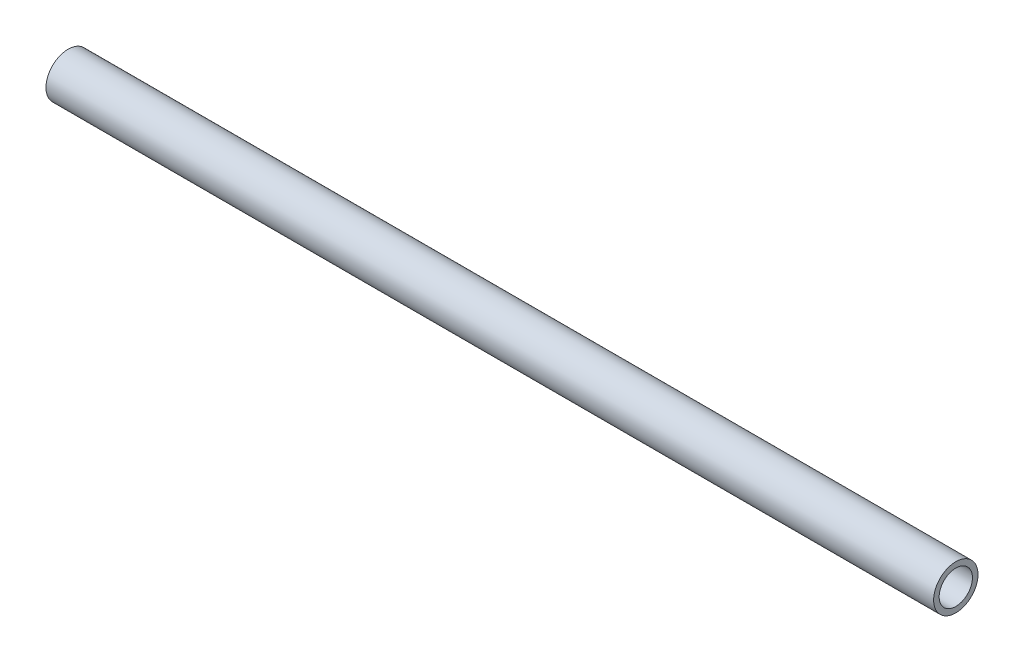
ISO-10303-21;
HEADER;
FILE_DESCRIPTION(('STEP AP214'),'2;1');
FILE_NAME('part.step','',(''),(''),'','','');
FILE_SCHEMA(('AUTOMOTIVE_DESIGN { 1 0 10303 214 1 1 1 1 }'));
ENDSEC;
DATA;
#1=APPLICATION_CONTEXT('core data for automotive mechanical design processes');
#2=APPLICATION_PROTOCOL_DEFINITION('international standard','automotive_design',2000,#1);
#3=PRODUCT_CONTEXT('',#1,'mechanical');
#4=PRODUCT('Part','Part','',(#3));
#5=PRODUCT_RELATED_PRODUCT_CATEGORY('part','',(#4));
#6=PRODUCT_DEFINITION_FORMATION('','',#4);
#7=PRODUCT_DEFINITION_CONTEXT('part definition',#1,'design');
#8=PRODUCT_DEFINITION('design','',#6,#7);
#9=PRODUCT_DEFINITION_SHAPE('','',#8);
#10=(LENGTH_UNIT() NAMED_UNIT(*) SI_UNIT(.MILLI.,.METRE.));
#11=(NAMED_UNIT(*) PLANE_ANGLE_UNIT() SI_UNIT($,.RADIAN.));
#12=(NAMED_UNIT(*) SI_UNIT($,.STERADIAN.) SOLID_ANGLE_UNIT());
#13=UNCERTAINTY_MEASURE_WITH_UNIT(LENGTH_MEASURE(1.E-05),#10,'distance_accuracy_value','');
#14=(GEOMETRIC_REPRESENTATION_CONTEXT(3) GLOBAL_UNCERTAINTY_ASSIGNED_CONTEXT((#13)) GLOBAL_UNIT_ASSIGNED_CONTEXT((#10,
#11,#12)) REPRESENTATION_CONTEXT('',''));
#15=CARTESIAN_POINT('',(0.,0.,0.));
#16=DIRECTION('',(0.,0.,1.));
#17=DIRECTION('',(1.,0.,0.));
#18=AXIS2_PLACEMENT_3D('',#15,#16,#17);
#19=CARTESIAN_POINT('',(457.2,0.,0.));
#20=DIRECTION('',(1.,0.,0.));
#21=DIRECTION('',(0.,0.,-1.));
#22=AXIS2_PLACEMENT_3D('',#19,#20,#21);
#23=PLANE('',#22);
#24=CARTESIAN_POINT('',(457.2,0.,0.));
#25=DIRECTION('',(1.,0.,0.));
#26=DIRECTION('',(0.,0.,-1.));
#27=AXIS2_PLACEMENT_3D('',#24,#25,#26);
#28=CIRCLE('',#27,12.7);
#29=CARTESIAN_POINT('',(457.2,0.,-12.7));
#30=VERTEX_POINT('',#29);
#31=EDGE_CURVE('E11',#30,#30,#28,.T.);
#32=ORIENTED_EDGE('',*,*,#31,.T.);
#33=EDGE_LOOP('',(#32));
#34=FACE_BOUND('',#33,.T.);
#35=CARTESIAN_POINT('',(457.2,0.,0.));
#36=DIRECTION('',(1.,0.,0.));
#37=DIRECTION('',(0.,0.,-1.));
#38=AXIS2_PLACEMENT_3D('',#35,#36,#37);
#39=CIRCLE('',#38,9.525);
#40=CARTESIAN_POINT('',(457.2,0.,-9.525));
#41=VERTEX_POINT('',#40);
#42=EDGE_CURVE('E48',#41,#41,#39,.T.);
#43=ORIENTED_EDGE('',*,*,#42,.F.);
#44=EDGE_LOOP('',(#43));
#45=FACE_BOUND('',#44,.T.);
#46=ADVANCED_FACE('F39',(#34,#45),#23,.T.);
#47=CARTESIAN_POINT('',(457.2,0.,0.));
#48=DIRECTION('',(-1.,0.,0.));
#49=DIRECTION('',(0.,0.,1.));
#50=AXIS2_PLACEMENT_3D('',#47,#48,#49);
#51=CYLINDRICAL_SURFACE('',#50,12.7);
#52=CARTESIAN_POINT('',(-50.8,0.,0.));
#53=DIRECTION('',(1.,0.,0.));
#54=DIRECTION('',(0.,0.,-1.));
#55=AXIS2_PLACEMENT_3D('',#52,#53,#54);
#56=CIRCLE('',#55,12.7);
#57=CARTESIAN_POINT('',(-50.8,0.,-12.7));
#58=VERTEX_POINT('',#57);
#59=EDGE_CURVE('E55',#58,#58,#56,.F.);
#60=ORIENTED_EDGE('',*,*,#59,.F.);
#61=EDGE_LOOP('',(#60));
#62=FACE_BOUND('',#61,.T.);
#63=ORIENTED_EDGE('',*,*,#31,.F.);
#64=EDGE_LOOP('',(#63));
#65=FACE_BOUND('',#64,.T.);
#66=ADVANCED_FACE('F41',(#62,#65),#51,.T.);
#67=CARTESIAN_POINT('',(457.2,0.,0.));
#68=DIRECTION('',(-1.,0.,0.));
#69=DIRECTION('',(0.,0.,1.));
#70=AXIS2_PLACEMENT_3D('',#67,#68,#69);
#71=CYLINDRICAL_SURFACE('',#70,9.525);
#72=CARTESIAN_POINT('',(-50.8,0.,0.));
#73=DIRECTION('',(1.,0.,0.));
#74=DIRECTION('',(0.,0.,-1.));
#75=AXIS2_PLACEMENT_3D('',#72,#73,#74);
#76=CIRCLE('',#75,9.525);
#77=CARTESIAN_POINT('',(-50.8,0.,-9.525));
#78=VERTEX_POINT('',#77);
#79=EDGE_CURVE('E43',#78,#78,#76,.T.);
#80=ORIENTED_EDGE('',*,*,#79,.F.);
#81=EDGE_LOOP('',(#80));
#82=FACE_BOUND('',#81,.T.);
#83=ORIENTED_EDGE('',*,*,#42,.T.);
#84=EDGE_LOOP('',(#83));
#85=FACE_BOUND('',#84,.T.);
#86=ADVANCED_FACE('F66',(#82,#85),#71,.F.);
#87=CARTESIAN_POINT('',(-50.8,0.,0.));
#88=DIRECTION('',(1.,0.,0.));
#89=DIRECTION('',(0.,0.,-1.));
#90=AXIS2_PLACEMENT_3D('',#87,#88,#89);
#91=PLANE('',#90);
#92=ORIENTED_EDGE('',*,*,#79,.T.);
#93=EDGE_LOOP('',(#92));
#94=FACE_BOUND('',#93,.T.);
#95=ORIENTED_EDGE('',*,*,#59,.T.);
#96=EDGE_LOOP('',(#95));
#97=FACE_BOUND('',#96,.T.);
#98=ADVANCED_FACE('F64',(#94,#97),#91,.F.);
#99=CLOSED_SHELL('',(#46,#66,#86,#98));
#100=MANIFOLD_SOLID_BREP('B2',#99);
#101=ADVANCED_BREP_SHAPE_REPRESENTATION('',(#18,#100),#14);
#102=SHAPE_DEFINITION_REPRESENTATION(#9,#101);
ENDSEC;
END-ISO-10303-21;
